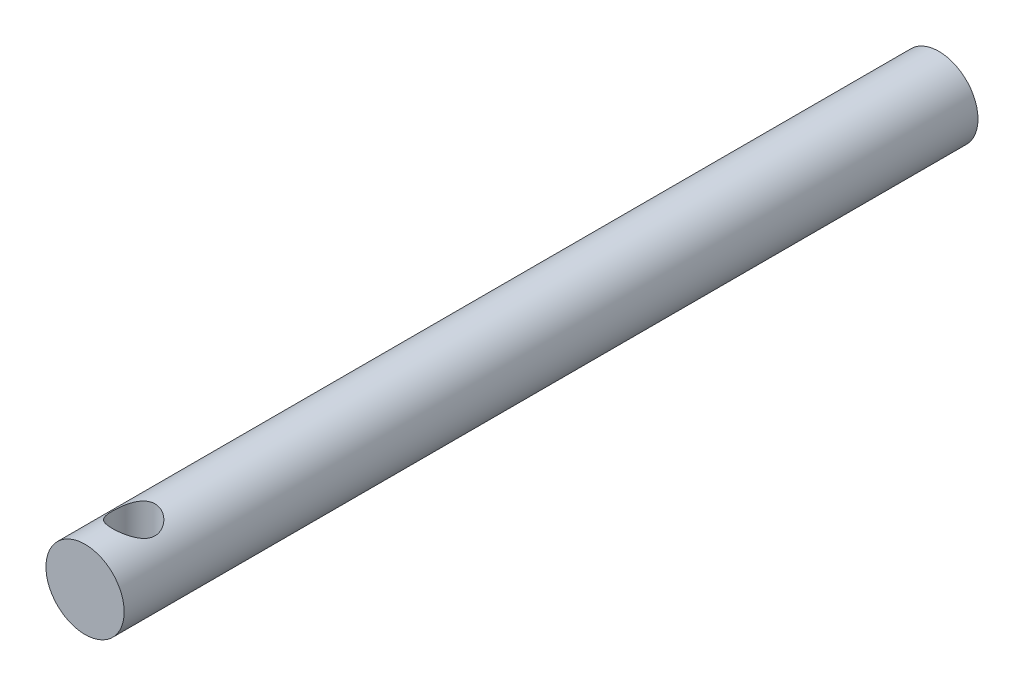
ISO-10303-21;
HEADER;
FILE_DESCRIPTION(('STEP AP214'),'2;1');
FILE_NAME('part.step','',(''),(''),'','','');
FILE_SCHEMA(('AUTOMOTIVE_DESIGN { 1 0 10303 214 1 1 1 1 }'));
ENDSEC;
DATA;
#1=APPLICATION_CONTEXT('core data for automotive mechanical design processes');
#2=APPLICATION_PROTOCOL_DEFINITION('international standard','automotive_design',2000,#1);
#3=PRODUCT_CONTEXT('',#1,'mechanical');
#4=PRODUCT('Part','Part','',(#3));
#5=PRODUCT_RELATED_PRODUCT_CATEGORY('part','',(#4));
#6=PRODUCT_DEFINITION_FORMATION('','',#4);
#7=PRODUCT_DEFINITION_CONTEXT('part definition',#1,'design');
#8=PRODUCT_DEFINITION('design','',#6,#7);
#9=PRODUCT_DEFINITION_SHAPE('','',#8);
#10=(LENGTH_UNIT() NAMED_UNIT(*) SI_UNIT(.MILLI.,.METRE.));
#11=(NAMED_UNIT(*) PLANE_ANGLE_UNIT() SI_UNIT($,.RADIAN.));
#12=(NAMED_UNIT(*) SI_UNIT($,.STERADIAN.) SOLID_ANGLE_UNIT());
#13=UNCERTAINTY_MEASURE_WITH_UNIT(LENGTH_MEASURE(1.E-05),#10,'distance_accuracy_value','');
#14=(GEOMETRIC_REPRESENTATION_CONTEXT(3) GLOBAL_UNCERTAINTY_ASSIGNED_CONTEXT((#13)) GLOBAL_UNIT_ASSIGNED_CONTEXT((#10,
#11,#12)) REPRESENTATION_CONTEXT('',''));
#15=CARTESIAN_POINT('',(0.,0.,0.));
#16=DIRECTION('',(0.,0.,1.));
#17=DIRECTION('',(1.,0.,0.));
#18=AXIS2_PLACEMENT_3D('',#15,#16,#17);
#19=CARTESIAN_POINT('',(0.,0.,60.));
#20=DIRECTION('',(0.,0.,-1.));
#21=DIRECTION('',(-1.,0.,0.));
#22=AXIS2_PLACEMENT_3D('',#19,#20,#21);
#23=CYLINDRICAL_SURFACE('',#22,2.75);
#24=CARTESIAN_POINT('',(0.,2.75,55.083270629546));
#25=CARTESIAN_POINT('',(0.077972949159201,2.74999553289391,55.0832755927254));
#26=CARTESIAN_POINT('',(0.156011763199372,2.74664984832556,55.0893855952712));
#27=CARTESIAN_POINT('',(0.309727419942129,2.73359531725478,55.1135283153583));
#28=CARTESIAN_POINT('',(0.385400760270944,2.72387746390221,55.131577909436));
#29=CARTESIAN_POINT('',(0.531939595227231,2.69908175997792,55.1786568603313));
#30=CARTESIAN_POINT('',(0.602823420032497,2.68402590603009,55.2076411886703));
#31=CARTESIAN_POINT('',(0.738583753627363,2.64988699120144,55.2755017036346));
#32=CARTESIAN_POINT('',(0.803460066484473,2.63080379903717,55.3143782127344));
#33=CARTESIAN_POINT('',(0.930328626822292,2.58877435218394,55.403897735989));
#34=CARTESIAN_POINT('',(0.991824039823097,2.56565357097934,55.4551615112126));
#35=CARTESIAN_POINT('',(1.10581385535795,2.51862762447079,55.5666384408657));
#36=CARTESIAN_POINT('',(1.15829998946552,2.49472176235856,55.6268597226111));
#37=CARTESIAN_POINT('',(1.25789480508437,2.44613124305119,55.7614628307517));
#38=CARTESIAN_POINT('',(1.30399588373323,2.42159402839635,55.8366503401105));
#39=CARTESIAN_POINT('',(1.38271834252753,2.37752741687072,55.9951374996745));
#40=CARTESIAN_POINT('',(1.41535032352209,2.35799408630603,56.0784307062379));
#41=CARTESIAN_POINT('',(1.46390282772391,2.32814537755157,56.2455344541534));
#42=CARTESIAN_POINT('',(1.48074714512668,2.31732653409192,56.3289813853947));
#43=CARTESIAN_POINT('',(1.49999173211584,2.30492353478053,56.4981547936197));
#44=CARTESIAN_POINT('',(1.50241200252224,2.30332659165822,56.5838779484575));
#45=CARTESIAN_POINT('',(1.49341328400853,2.30916059512703,56.7413643593988));
#46=CARTESIAN_POINT('',(1.48400270922342,2.31528177670115,56.8133044150515));
#47=CARTESIAN_POINT('',(1.45515575974202,2.33351887542567,56.9543587083095));
#48=CARTESIAN_POINT('',(1.43571497274773,2.34563743072956,57.023471687829));
#49=CARTESIAN_POINT('',(1.38709156246769,2.37471884026675,57.1588283682338));
#50=CARTESIAN_POINT('',(1.35770543388282,2.39178172165247,57.2249764272059));
#51=CARTESIAN_POINT('',(1.29019902560379,2.42886159364228,57.3517428270446));
#52=CARTESIAN_POINT('',(1.25207494308154,2.44887986910388,57.4123587441716));
#53=CARTESIAN_POINT('',(1.16132176252092,2.49334307244702,57.5362144093682));
#54=CARTESIAN_POINT('',(1.10736092970256,2.51799359501409,57.5984082190289));
#55=CARTESIAN_POINT('',(0.989793791710636,2.56648691782872,57.7133468007646));
#56=CARTESIAN_POINT('',(0.926181138373375,2.59032917374526,57.7660853037513));
#57=CARTESIAN_POINT('',(0.785961873234598,2.63638937585234,57.8639076667992));
#58=CARTESIAN_POINT('',(0.70877963986544,2.65840123043428,57.9082718370517));
#59=CARTESIAN_POINT('',(0.546555778353405,2.69642211220391,57.9829956509153));
#60=CARTESIAN_POINT('',(0.461521526804289,2.71243670343128,58.0133682814124));
#61=CARTESIAN_POINT('',(0.294396859582251,2.73537507908384,58.0563878811039));
#62=CARTESIAN_POINT('',(0.212758791189681,2.74300133491569,58.0704118256971));
#63=CARTESIAN_POINT('',(0.0479518531447218,2.75081609737275,58.0847796260477));
#64=CARTESIAN_POINT('',(-0.0352160323678899,2.75100922913374,58.0851319887171));
#65=CARTESIAN_POINT('',(-0.192203941982916,2.74429233918013,58.0727870100651));
#66=CARTESIAN_POINT('',(-0.266156276118835,2.73806095216361,58.0613364588989));
#67=CARTESIAN_POINT('',(-0.41090173026521,2.7201065477026,58.0278050904003));
#68=CARTESIAN_POINT('',(-0.481694527463725,2.70838297051789,58.0057231895604));
#69=CARTESIAN_POINT('',(-0.620072033300046,2.68013382891396,57.9511788942903));
#70=CARTESIAN_POINT('',(-0.687544326035436,2.6635032440995,57.9184877239045));
#71=CARTESIAN_POINT('',(-0.816227077628908,2.62692883380052,57.8439486736738));
#72=CARTESIAN_POINT('',(-0.877435190860022,2.60698377449004,57.8020973820919));
#73=CARTESIAN_POINT('',(-0.999076047764805,2.56300184221369,57.7051216360037));
#74=CARTESIAN_POINT('',(-1.05867122088779,2.5387564598654,57.6490402442603));
#75=CARTESIAN_POINT('',(-1.16805413999383,2.49032836693212,57.5278975384295));
#76=CARTESIAN_POINT('',(-1.21783196696366,2.46614574384712,57.462827254059));
#77=CARTESIAN_POINT('',(-1.30981050679895,2.41863034974007,57.3195916877998));
#78=CARTESIAN_POINT('',(-1.35116579672796,2.39549649377281,57.2408109383206));
#79=CARTESIAN_POINT('',(-1.41962887927166,2.35557673325722,57.0758159418449));
#80=CARTESIAN_POINT('',(-1.44675734230938,2.33878162902652,56.9896126924827));
#81=CARTESIAN_POINT('',(-1.48328938456405,2.31576769108303,56.8210596417212));
#82=CARTESIAN_POINT('',(-1.49416166817435,2.30867825825265,56.7391519524878));
#83=CARTESIAN_POINT('',(-1.50223385888717,2.30343772372917,56.5744058619462));
#84=CARTESIAN_POINT('',(-1.49944478599832,2.30527941768142,56.4915682645575));
#85=CARTESIAN_POINT('',(-1.48170001222614,2.31670968294054,56.3389839180366));
#86=CARTESIAN_POINT('',(-1.46839952788391,2.32524317806448,56.2689529645193));
#87=CARTESIAN_POINT('',(-1.4323386957082,2.34762721988834,56.1322662970376));
#88=CARTESIAN_POINT('',(-1.40957457682849,2.36147988599044,56.0656119404627));
#89=CARTESIAN_POINT('',(-1.35370854482785,2.39396641086271,55.9329028736993));
#90=CARTESIAN_POINT('',(-1.3200513188859,2.41284421791643,55.8671437783467));
#91=CARTESIAN_POINT('',(-1.24388744619949,2.45297719359377,55.7417652985634));
#92=CARTESIAN_POINT('',(-1.20137607356301,2.47423362899283,55.6821492184647));
#93=CARTESIAN_POINT('',(-1.1011070383827,2.52062694545993,55.5611925042931));
#94=CARTESIAN_POINT('',(-1.04201074304019,2.54585863647192,55.5009917713652));
#95=CARTESIAN_POINT('',(-0.914094879509429,2.59453539642989,55.3909834207527));
#96=CARTESIAN_POINT('',(-0.845268583073129,2.61797921165257,55.3411830544038));
#97=CARTESIAN_POINT('',(-0.696873306455463,2.66139613447405,55.2520712863317));
#98=CARTESIAN_POINT('',(-0.617032473182113,2.68123529430282,55.2131434413452));
#99=CARTESIAN_POINT('',(-0.450596179441348,2.71414877932511,55.1497984770939));
#100=CARTESIAN_POINT('',(-0.36401891505752,2.72724064660339,55.1253437048829));
#101=CARTESIAN_POINT('',(-0.230355165227763,2.74071669432246,55.1003441545468));
#102=CARTESIAN_POINT('',(-0.184596650535411,2.74418450271714,55.0939550778935));
#103=CARTESIAN_POINT('',(-0.0925664947855397,2.74882747533462,55.0854168537395));
#104=CARTESIAN_POINT('',(-0.0462948565710308,2.75000265225361,55.083267682759));
#105=CARTESIAN_POINT('',(0.,2.75,55.083270629546));
#106=B_SPLINE_CURVE_WITH_KNOTS('',3,(#24,#25,#26,#27,#28,#29,#30,#31,#32,#33,#34,#35,#36,#37,
#38,#39,#40,#41,#42,#43,#44,#45,#46,#47,#48,#49,#50,#51,#52,#53,#54,#55,#56,#57,#58,#59,#60,#61,
#62,#63,#64,#65,#66,#67,#68,#69,#70,#71,#72,#73,#74,#75,#76,#77,#78,#79,#80,#81,#82,#83,#84,#85,
#86,#87,#88,#89,#90,#91,#92,#93,#94,#95,#96,#97,#98,#99,#100,#101,#102,#103,#104,#105),
.UNSPECIFIED.,.T.,.F.,(4,2,2,2,2,2,2,2,2,2,2,2,2,2,2,2,2,2,2,2,2,2,2,2,2,2,2,2,2,2,2,2,2,2,2,2,
2,2,2,2,4),(0.,0.233732365670663,0.467795818544869,0.700905752709475,0.934023286981207,
1.18300734378138,1.43221870235056,1.70547758592502,1.97852098918855,2.23435206692626,
2.48982831886023,2.70723672174195,2.92474084439228,3.14699566236443,3.36934739171625,
3.62611318738824,3.88304860020488,4.15667273405989,4.43004237689777,4.67818789377311,
4.92617900379767,5.15041519453526,5.37467424342679,5.60413212023295,5.83367560575034,
6.08865618522294,6.34389308070037,6.61822417400225,6.89215557446505,7.13941350035999,
7.38647200714689,7.6009068270719,7.81542717649291,8.04330134656288,8.27129745737791,
8.53429002491757,8.79746534824314,9.06900285379736,9.33983078990054,9.47860540833467,
9.61737925825842),.UNSPECIFIED.);
#107=CARTESIAN_POINT('',(0.,2.75,55.083270629546));
#108=VERTEX_POINT('',#107);
#109=EDGE_CURVE('E41',#108,#108,#106,.T.);
#110=ORIENTED_EDGE('',*,*,#109,.T.);
#111=EDGE_LOOP('',(#110));
#112=FACE_BOUND('',#111,.T.);
#113=CARTESIAN_POINT('',(0.,-2.75,58.083270629546));
#114=CARTESIAN_POINT('',(0.077972949159201,-2.74999553289391,58.0832656663667));
#115=CARTESIAN_POINT('',(0.156011763199372,-2.74664984832556,58.0771556638208));
#116=CARTESIAN_POINT('',(0.309727419942129,-2.73359531725478,58.0530129437338));
#117=CARTESIAN_POINT('',(0.385400760270944,-2.72387746390221,58.0349633496561));
#118=CARTESIAN_POINT('',(0.531939595227231,-2.69908175997792,57.9878843987608));
#119=CARTESIAN_POINT('',(0.602823420032497,-2.68402590603009,57.9589000704218));
#120=CARTESIAN_POINT('',(0.738583753627363,-2.64988699120144,57.8910395554574));
#121=CARTESIAN_POINT('',(0.803460066484473,-2.63080379903717,57.8521630463577));
#122=CARTESIAN_POINT('',(0.930328626822292,-2.58877435218394,57.7626435231031));
#123=CARTESIAN_POINT('',(0.991824039823097,-2.56565357097934,57.7113797478794));
#124=CARTESIAN_POINT('',(1.10581385535795,-2.51862762447079,57.5999028182264));
#125=CARTESIAN_POINT('',(1.15829998946552,-2.49472176235856,57.539681536481));
#126=CARTESIAN_POINT('',(1.25789480508437,-2.44613124305119,57.4050784283403));
#127=CARTESIAN_POINT('',(1.30399588373323,-2.42159402839635,57.3298909189816));
#128=CARTESIAN_POINT('',(1.38271834252753,-2.37752741687072,57.1714037594176));
#129=CARTESIAN_POINT('',(1.41535032352209,-2.35799408630603,57.0881105528542));
#130=CARTESIAN_POINT('',(1.46390282772391,-2.32814537755157,56.9210068049387));
#131=CARTESIAN_POINT('',(1.48074714512668,-2.31732653409192,56.8375598736973));
#132=CARTESIAN_POINT('',(1.49999173211584,-2.30492353478053,56.6683864654724));
#133=CARTESIAN_POINT('',(1.50241200252224,-2.30332659165822,56.5826633106345));
#134=CARTESIAN_POINT('',(1.49341328400853,-2.30916059512703,56.4251768996932));
#135=CARTESIAN_POINT('',(1.48400270922342,-2.31528177670115,56.3532368440405));
#136=CARTESIAN_POINT('',(1.45515575974202,-2.33351887542567,56.2121825507825));
#137=CARTESIAN_POINT('',(1.43571497274773,-2.34563743072956,56.1430695712631));
#138=CARTESIAN_POINT('',(1.38709156246769,-2.37471884026675,56.0077128908583));
#139=CARTESIAN_POINT('',(1.35770543388282,-2.39178172165247,55.9415648318862));
#140=CARTESIAN_POINT('',(1.29019902560379,-2.42886159364228,55.8147984320474));
#141=CARTESIAN_POINT('',(1.25207494308154,-2.44887986910388,55.7541825149205));
#142=CARTESIAN_POINT('',(1.16132176252092,-2.49334307244702,55.6303268497238));
#143=CARTESIAN_POINT('',(1.10736092970256,-2.51799359501409,55.5681330400631));
#144=CARTESIAN_POINT('',(0.989793791710636,-2.56648691782872,55.4531944583275));
#145=CARTESIAN_POINT('',(0.926181138373375,-2.59032917374526,55.4004559553408));
#146=CARTESIAN_POINT('',(0.785961873234598,-2.63638937585234,55.3026335922929));
#147=CARTESIAN_POINT('',(0.70877963986544,-2.65840123043428,55.2582694220403));
#148=CARTESIAN_POINT('',(0.546555778353405,-2.69642211220391,55.1835456081767));
#149=CARTESIAN_POINT('',(0.461521526804289,-2.71243670343128,55.1531729776797));
#150=CARTESIAN_POINT('',(0.294396859582251,-2.73537507908384,55.1101533779881));
#151=CARTESIAN_POINT('',(0.212758791189681,-2.74300133491569,55.096129433395));
#152=CARTESIAN_POINT('',(0.0479518531447223,-2.75081609737275,55.0817616330443));
#153=CARTESIAN_POINT('',(-0.0352160323678896,-2.75100922913374,55.081409270375));
#154=CARTESIAN_POINT('',(-0.192203941982916,-2.74429233918013,55.093754249027));
#155=CARTESIAN_POINT('',(-0.266156276118835,-2.73806095216361,55.1052048001932));
#156=CARTESIAN_POINT('',(-0.41090173026521,-2.7201065477026,55.1387361686918));
#157=CARTESIAN_POINT('',(-0.481694527463725,-2.70838297051789,55.1608180695316));
#158=CARTESIAN_POINT('',(-0.620072033300047,-2.68013382891396,55.2153623648017));
#159=CARTESIAN_POINT('',(-0.687544326035438,-2.6635032440995,55.2480535351876));
#160=CARTESIAN_POINT('',(-0.81622707762891,-2.62692883380052,55.3225925854183));
#161=CARTESIAN_POINT('',(-0.877435190860023,-2.60698377449004,55.3644438770001));
#162=CARTESIAN_POINT('',(-0.999076047764805,-2.56300184221369,55.4614196230883));
#163=CARTESIAN_POINT('',(-1.05867122088779,-2.5387564598654,55.5175010148318));
#164=CARTESIAN_POINT('',(-1.16805413999383,-2.49032836693212,55.6386437206626));
#165=CARTESIAN_POINT('',(-1.21783196696366,-2.46614574384712,55.7037140050331));
#166=CARTESIAN_POINT('',(-1.30981050679895,-2.41863034974007,55.8469495712922));
#167=CARTESIAN_POINT('',(-1.35116579672796,-2.39549649377281,55.9257303207715));
#168=CARTESIAN_POINT('',(-1.41962887927166,-2.35557673325722,56.0907253172472));
#169=CARTESIAN_POINT('',(-1.44675734230938,-2.33878162902652,56.1769285666094));
#170=CARTESIAN_POINT('',(-1.48328938456405,-2.31576769108303,56.3454816173709));
#171=CARTESIAN_POINT('',(-1.49416166817435,-2.30867825825265,56.4273893066043));
#172=CARTESIAN_POINT('',(-1.50223385888717,-2.30343772372917,56.5921353971459));
#173=CARTESIAN_POINT('',(-1.49944478599832,-2.30527941768142,56.6749729945346));
#174=CARTESIAN_POINT('',(-1.48170001222614,-2.31670968294054,56.8275573410555));
#175=CARTESIAN_POINT('',(-1.4683995278839,-2.32524317806448,56.8975882945727));
#176=CARTESIAN_POINT('',(-1.4323386957082,-2.34762721988834,57.0342749620544));
#177=CARTESIAN_POINT('',(-1.40957457682849,-2.36147988599044,57.1009293186293));
#178=CARTESIAN_POINT('',(-1.35370854482785,-2.39396641086271,57.2336383853928));
#179=CARTESIAN_POINT('',(-1.3200513188859,-2.41284421791643,57.2993974807453));
#180=CARTESIAN_POINT('',(-1.24388744619949,-2.45297719359377,57.4247759605287));
#181=CARTESIAN_POINT('',(-1.20137607356301,-2.47423362899283,57.4843920406274));
#182=CARTESIAN_POINT('',(-1.10110703838269,-2.52062694545993,57.605348754799));
#183=CARTESIAN_POINT('',(-1.04201074304019,-2.54585863647192,57.6655494877269));
#184=CARTESIAN_POINT('',(-0.914094879509426,-2.59453539642989,57.7755578383393));
#185=CARTESIAN_POINT('',(-0.845268583073128,-2.61797921165257,57.8253582046882));
#186=CARTESIAN_POINT('',(-0.696873306455466,-2.66139613447405,57.9144699727604));
#187=CARTESIAN_POINT('',(-0.617032473182119,-2.68123529430282,57.9533978177469));
#188=CARTESIAN_POINT('',(-0.450596179441354,-2.71414877932511,58.0167427819982));
#189=CARTESIAN_POINT('',(-0.364018915057524,-2.72724064660339,58.0411975542092));
#190=CARTESIAN_POINT('',(-0.230355165227763,-2.74071669432246,58.0661971045453));
#191=CARTESIAN_POINT('',(-0.184596650535411,-2.74418450271714,58.0725861811986));
#192=CARTESIAN_POINT('',(-0.0925664947855397,-2.74882747533462,58.0811244053525));
#193=CARTESIAN_POINT('',(-0.0462948565710308,-2.75000265225361,58.0832735763331));
#194=CARTESIAN_POINT('',(0.,-2.75,58.083270629546));
#195=B_SPLINE_CURVE_WITH_KNOTS('',3,(#113,#114,#115,#116,#117,#118,#119,#120,#121,#122,#123,
#124,#125,#126,#127,#128,#129,#130,#131,#132,#133,#134,#135,#136,#137,#138,#139,#140,#141,#142,
#143,#144,#145,#146,#147,#148,#149,#150,#151,#152,#153,#154,#155,#156,#157,#158,#159,#160,#161,
#162,#163,#164,#165,#166,#167,#168,#169,#170,#171,#172,#173,#174,#175,#176,#177,#178,#179,#180,
#181,#182,#183,#184,#185,#186,#187,#188,#189,#190,#191,#192,#193,#194),.UNSPECIFIED.,.T.,.F.,(4,
2,2,2,2,2,2,2,2,2,2,2,2,2,2,2,2,2,2,2,2,2,2,2,2,2,2,2,2,2,2,2,2,2,2,2,2,2,2,2,4),(0.,
0.233732365670663,0.467795818544869,0.700905752709475,0.934023286981207,1.18300734378138,
1.43221870235056,1.70547758592502,1.97852098918855,2.23435206692626,2.48982831886023,
2.70723672174195,2.92474084439228,3.14699566236443,3.36934739171625,3.62611318738824,
3.88304860020488,4.15667273405989,4.43004237689777,4.6781878937731,4.92617900379767,
5.15041519453526,5.37467424342679,5.60413212023295,5.83367560575034,6.08865618522294,
6.34389308070037,6.61822417400225,6.89215557446505,7.13941350036,7.38647200714689,
7.6009068270719,7.81542717649291,8.04330134656288,8.27129745737791,8.53429002491757,
8.79746534824314,9.06900285379735,9.33983078990054,9.47860540833467,9.61737925825842),.UNSPECIFIED.);
#196=CARTESIAN_POINT('',(0.,-2.75,58.083270629546));
#197=VERTEX_POINT('',#196);
#198=EDGE_CURVE('E56',#197,#197,#195,.T.);
#199=ORIENTED_EDGE('',*,*,#198,.T.);
#200=EDGE_LOOP('',(#199));
#201=FACE_BOUND('',#200,.T.);
#202=CARTESIAN_POINT('',(0.,0.,60.));
#203=DIRECTION('',(0.,0.,1.));
#204=DIRECTION('',(1.,0.,0.));
#205=AXIS2_PLACEMENT_3D('',#202,#203,#204);
#206=CIRCLE('',#205,2.75);
#207=CARTESIAN_POINT('',(2.75,0.,60.));
#208=VERTEX_POINT('',#207);
#209=EDGE_CURVE('E10',#208,#208,#206,.T.);
#210=ORIENTED_EDGE('',*,*,#209,.F.);
#211=EDGE_LOOP('',(#210));
#212=FACE_BOUND('',#211,.T.);
#213=CARTESIAN_POINT('',(0.,0.,0.));
#214=DIRECTION('',(0.,0.,1.));
#215=DIRECTION('',(1.,0.,0.));
#216=AXIS2_PLACEMENT_3D('',#213,#214,#215);
#217=CIRCLE('',#216,2.75);
#218=CARTESIAN_POINT('',(2.75,0.,0.));
#219=VERTEX_POINT('',#218);
#220=EDGE_CURVE('E50',#219,#219,#217,.T.);
#221=ORIENTED_EDGE('',*,*,#220,.T.);
#222=EDGE_LOOP('',(#221));
#223=FACE_BOUND('',#222,.T.);
#224=ADVANCED_FACE('F37',(#112,#201,#212,#223),#23,.T.);
#225=CARTESIAN_POINT('',(0.,0.,60.));
#226=DIRECTION('',(0.,0.,1.));
#227=DIRECTION('',(1.,0.,0.));
#228=AXIS2_PLACEMENT_3D('',#225,#226,#227);
#229=PLANE('',#228);
#230=ORIENTED_EDGE('',*,*,#209,.T.);
#231=EDGE_LOOP('',(#230));
#232=FACE_BOUND('',#231,.T.);
#233=ADVANCED_FACE('F71',(#232),#229,.T.);
#234=CARTESIAN_POINT('',(0.,0.,0.));
#235=DIRECTION('',(0.,0.,1.));
#236=DIRECTION('',(1.,0.,0.));
#237=AXIS2_PLACEMENT_3D('',#234,#235,#236);
#238=PLANE('',#237);
#239=ORIENTED_EDGE('',*,*,#220,.F.);
#240=EDGE_LOOP('',(#239));
#241=FACE_BOUND('',#240,.T.);
#242=ADVANCED_FACE('F68',(#241),#238,.F.);
#243=CARTESIAN_POINT('',(0.,-3.,56.583270629546));
#244=DIRECTION('',(0.,1.,0.));
#245=DIRECTION('',(0.,0.,1.));
#246=AXIS2_PLACEMENT_3D('',#243,#244,#245);
#247=CYLINDRICAL_SURFACE('',#246,1.5);
#248=ORIENTED_EDGE('',*,*,#198,.F.);
#249=EDGE_LOOP('',(#248));
#250=FACE_BOUND('',#249,.T.);
#251=ORIENTED_EDGE('',*,*,#109,.F.);
#252=EDGE_LOOP('',(#251));
#253=FACE_BOUND('',#252,.T.);
#254=ADVANCED_FACE('F64',(#250,#253),#247,.F.);
#255=CLOSED_SHELL('',(#224,#233,#242,#254));
#256=MANIFOLD_SOLID_BREP('B2',#255);
#257=ADVANCED_BREP_SHAPE_REPRESENTATION('',(#18,#256),#14);
#258=SHAPE_DEFINITION_REPRESENTATION(#9,#257);
ENDSEC;
END-ISO-10303-21;
